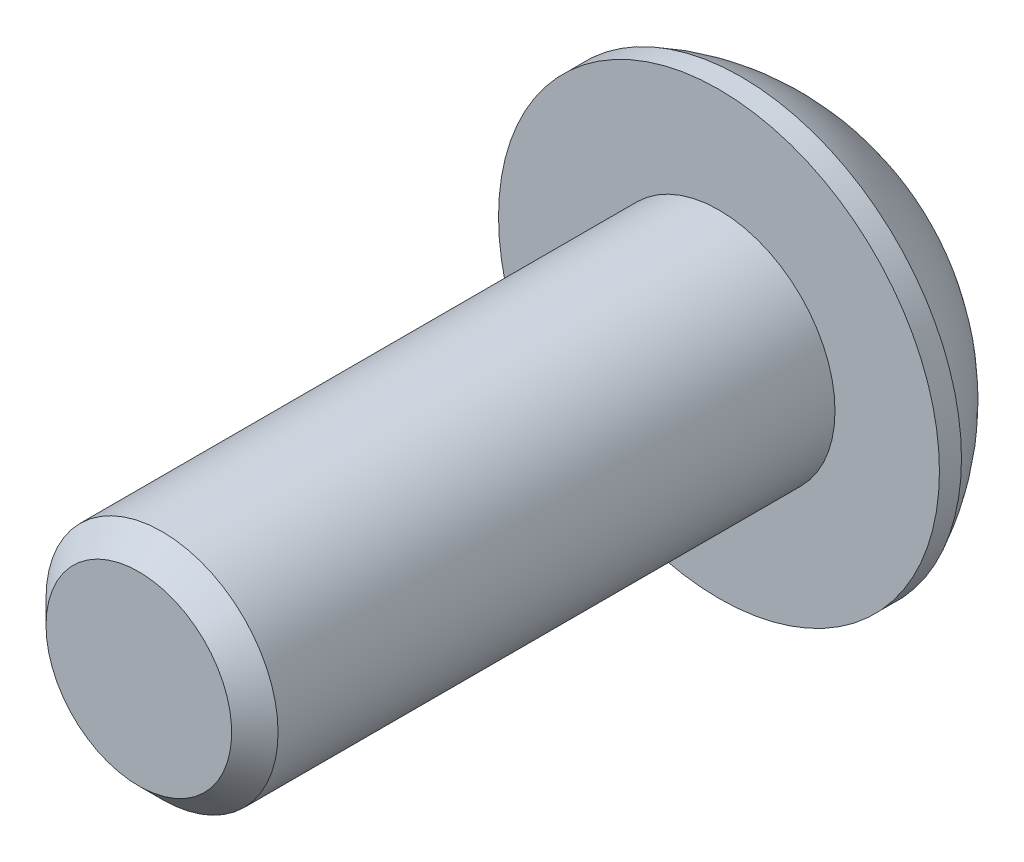
ISO-10303-21;
HEADER;
FILE_DESCRIPTION(('STEP AP214'),'2;1');
FILE_NAME('part.step','',(''),(''),'','','');
FILE_SCHEMA(('AUTOMOTIVE_DESIGN { 1 0 10303 214 1 1 1 1 }'));
ENDSEC;
DATA;
#1=APPLICATION_CONTEXT('core data for automotive mechanical design processes');
#2=APPLICATION_PROTOCOL_DEFINITION('international standard','automotive_design',2000,#1);
#3=PRODUCT_CONTEXT('',#1,'mechanical');
#4=PRODUCT('Part','Part','',(#3));
#5=PRODUCT_RELATED_PRODUCT_CATEGORY('part','',(#4));
#6=PRODUCT_DEFINITION_FORMATION('','',#4);
#7=PRODUCT_DEFINITION_CONTEXT('part definition',#1,'design');
#8=PRODUCT_DEFINITION('design','',#6,#7);
#9=PRODUCT_DEFINITION_SHAPE('','',#8);
#10=(LENGTH_UNIT() NAMED_UNIT(*) SI_UNIT(.MILLI.,.METRE.));
#11=(NAMED_UNIT(*) PLANE_ANGLE_UNIT() SI_UNIT($,.RADIAN.));
#12=(NAMED_UNIT(*) SI_UNIT($,.STERADIAN.) SOLID_ANGLE_UNIT());
#13=UNCERTAINTY_MEASURE_WITH_UNIT(LENGTH_MEASURE(1.E-05),#10,'distance_accuracy_value','');
#14=(GEOMETRIC_REPRESENTATION_CONTEXT(3) GLOBAL_UNCERTAINTY_ASSIGNED_CONTEXT((#13)) GLOBAL_UNIT_ASSIGNED_CONTEXT((#10,
#11,#12)) REPRESENTATION_CONTEXT('',''));
#15=CARTESIAN_POINT('',(0.,0.,0.));
#16=DIRECTION('',(0.,0.,1.));
#17=DIRECTION('',(1.,0.,0.));
#18=AXIS2_PLACEMENT_3D('',#15,#16,#17);
#19=CARTESIAN_POINT('',(0.,0.,-1.06));
#20=DIRECTION('',(0.,0.,1.));
#21=DIRECTION('',(1.,0.,0.));
#22=AXIS2_PLACEMENT_3D('',#19,#20,#21);
#23=PLANE('',#22);
#24=DIRECTION('',(-0.866025403784439,-0.5,0.));
#25=VECTOR('',#24,1.);
#26=CARTESIAN_POINT('',(-1.25,0.721687836487032,-1.06));
#27=LINE('',#26,#25);
#28=CARTESIAN_POINT('',(-1.25,0.721687836487032,-1.06));
#29=VERTEX_POINT('',#28);
#30=CARTESIAN_POINT('',(0.,1.44337567297406,-1.06));
#31=VERTEX_POINT('',#30);
#32=EDGE_CURVE('E68',#29,#31,#27,.F.);
#33=ORIENTED_EDGE('',*,*,#32,.T.);
#34=DIRECTION('',(-0.866025403784439,0.5,0.));
#35=VECTOR('',#34,1.);
#36=CARTESIAN_POINT('',(0.,1.44337567297406,-1.06));
#37=LINE('',#36,#35);
#38=CARTESIAN_POINT('',(1.25,0.721687836487031,-1.06));
#39=VERTEX_POINT('',#38);
#40=EDGE_CURVE('E70',#31,#39,#37,.F.);
#41=ORIENTED_EDGE('',*,*,#40,.T.);
#42=DIRECTION('',(0.,1.,0.));
#43=VECTOR('',#42,1.);
#44=CARTESIAN_POINT('',(1.25,0.721687836487032,-1.06));
#45=LINE('',#44,#43);
#46=CARTESIAN_POINT('',(1.25,-0.721687836487032,-1.06));
#47=VERTEX_POINT('',#46);
#48=EDGE_CURVE('E72',#39,#47,#45,.F.);
#49=ORIENTED_EDGE('',*,*,#48,.T.);
#50=DIRECTION('',(0.866025403784439,0.499999999999999,0.));
#51=VECTOR('',#50,1.);
#52=CARTESIAN_POINT('',(1.25,-0.721687836487032,-1.06));
#53=LINE('',#52,#51);
#54=CARTESIAN_POINT('',(0.,-1.44337567297406,-1.06));
#55=VERTEX_POINT('',#54);
#56=EDGE_CURVE('E144',#47,#55,#53,.F.);
#57=ORIENTED_EDGE('',*,*,#56,.T.);
#58=DIRECTION('',(0.866025403784438,-0.5,0.));
#59=VECTOR('',#58,1.);
#60=CARTESIAN_POINT('',(0.,-1.44337567297406,-1.06));
#61=LINE('',#60,#59);
#62=CARTESIAN_POINT('',(-1.25,-0.721687836487031,-1.06));
#63=VERTEX_POINT('',#62);
#64=EDGE_CURVE('E151',#55,#63,#61,.F.);
#65=ORIENTED_EDGE('',*,*,#64,.T.);
#66=DIRECTION('',(0.,1.,0.));
#67=VECTOR('',#66,1.);
#68=CARTESIAN_POINT('',(-1.25,-0.721687836487032,-1.06));
#69=LINE('',#68,#67);
#70=EDGE_CURVE('E157',#63,#29,#69,.T.);
#71=ORIENTED_EDGE('',*,*,#70,.T.);
#72=EDGE_LOOP('',(#33,#41,#49,#57,#65,#71));
#73=FACE_BOUND('',#72,.T.);
#74=ADVANCED_FACE('F16',(#73),#23,.F.);
#75=CARTESIAN_POINT('',(1.25,0.721687836487032,-2.2));
#76=DIRECTION('',(1.,0.,0.));
#77=DIRECTION('',(0.,0.,-1.));
#78=AXIS2_PLACEMENT_3D('',#75,#76,#77);
#79=PLANE('',#78);
#80=ORIENTED_EDGE('',*,*,#48,.F.);
#81=DIRECTION('',(0.,0.,1.));
#82=VECTOR('',#81,1.);
#83=CARTESIAN_POINT('',(1.25,0.721687836487029,-2.2));
#84=LINE('',#83,#82);
#85=CARTESIAN_POINT('',(1.25,0.721687836487031,-2.2));
#86=VERTEX_POINT('',#85);
#87=EDGE_CURVE('E78',#39,#86,#84,.F.);
#88=ORIENTED_EDGE('',*,*,#87,.T.);
#89=DIRECTION('',(0.,1.,0.));
#90=VECTOR('',#89,1.);
#91=CARTESIAN_POINT('',(1.25,-0.95,-2.2));
#92=LINE('',#91,#90);
#93=CARTESIAN_POINT('',(1.25,-0.721687836487032,-2.2));
#94=VERTEX_POINT('',#93);
#95=EDGE_CURVE('E139',#94,#86,#92,.T.);
#96=ORIENTED_EDGE('',*,*,#95,.F.);
#97=DIRECTION('',(0.,0.,1.));
#98=VECTOR('',#97,1.);
#99=CARTESIAN_POINT('',(1.25,-0.721687836487032,-2.2));
#100=LINE('',#99,#98);
#101=EDGE_CURVE('E84',#94,#47,#100,.T.);
#102=ORIENTED_EDGE('',*,*,#101,.T.);
#103=EDGE_LOOP('',(#80,#88,#96,#102));
#104=FACE_BOUND('',#103,.T.);
#105=ADVANCED_FACE('F81',(#104),#79,.F.);
#106=CARTESIAN_POINT('',(0.,1.44337567297406,-2.2));
#107=DIRECTION('',(0.5,0.866025403784439,0.));
#108=DIRECTION('',(-0.866025403784439,0.5,0.));
#109=AXIS2_PLACEMENT_3D('',#106,#107,#108);
#110=PLANE('',#109);
#111=ORIENTED_EDGE('',*,*,#40,.F.);
#112=DIRECTION('',(0.,0.,1.));
#113=VECTOR('',#112,1.);
#114=CARTESIAN_POINT('',(0.,1.44337567297406,-2.2));
#115=LINE('',#114,#113);
#116=CARTESIAN_POINT('',(0.,1.44337567297406,-2.2));
#117=VERTEX_POINT('',#116);
#118=EDGE_CURVE('E97',#31,#117,#115,.F.);
#119=ORIENTED_EDGE('',*,*,#118,.T.);
#120=DIRECTION('',(-0.86602540378444,0.499999999999998,0.));
#121=VECTOR('',#120,1.);
#122=CARTESIAN_POINT('',(1.25,0.721687836487032,-2.2));
#123=LINE('',#122,#121);
#124=EDGE_CURVE('E90',#86,#117,#123,.T.);
#125=ORIENTED_EDGE('',*,*,#124,.F.);
#126=ORIENTED_EDGE('',*,*,#87,.F.);
#127=EDGE_LOOP('',(#111,#119,#125,#126));
#128=FACE_BOUND('',#127,.T.);
#129=ADVANCED_FACE('F88',(#128),#110,.F.);
#130=CARTESIAN_POINT('',(-1.25,0.721687836487032,-2.2));
#131=DIRECTION('',(-0.5,0.866025403784439,0.));
#132=DIRECTION('',(-0.866025403784439,-0.5,0.));
#133=AXIS2_PLACEMENT_3D('',#130,#131,#132);
#134=PLANE('',#133);
#135=ORIENTED_EDGE('',*,*,#32,.F.);
#136=DIRECTION('',(0.,0.,1.));
#137=VECTOR('',#136,1.);
#138=CARTESIAN_POINT('',(-1.25,0.721687836487032,-2.2));
#139=LINE('',#138,#137);
#140=CARTESIAN_POINT('',(-1.25,0.721687836487032,-2.2));
#141=VERTEX_POINT('',#140);
#142=EDGE_CURVE('E154',#29,#141,#139,.F.);
#143=ORIENTED_EDGE('',*,*,#142,.T.);
#144=DIRECTION('',(-0.86602540378444,-0.499999999999998,0.));
#145=VECTOR('',#144,1.);
#146=CARTESIAN_POINT('',(0.,1.44337567297406,-2.2));
#147=LINE('',#146,#145);
#148=EDGE_CURVE('E133',#117,#141,#147,.T.);
#149=ORIENTED_EDGE('',*,*,#148,.F.);
#150=ORIENTED_EDGE('',*,*,#118,.F.);
#151=EDGE_LOOP('',(#135,#143,#149,#150));
#152=FACE_BOUND('',#151,.T.);
#153=ADVANCED_FACE('F161',(#152),#134,.F.);
#154=CARTESIAN_POINT('',(-1.25,-0.721687836487032,-2.2));
#155=DIRECTION('',(-1.,0.,0.));
#156=DIRECTION('',(0.,0.,1.));
#157=AXIS2_PLACEMENT_3D('',#154,#155,#156);
#158=PLANE('',#157);
#159=ORIENTED_EDGE('',*,*,#70,.F.);
#160=DIRECTION('',(0.,0.,1.));
#161=VECTOR('',#160,1.);
#162=CARTESIAN_POINT('',(-1.25,-0.721687836487029,-2.2));
#163=LINE('',#162,#161);
#164=CARTESIAN_POINT('',(-1.25,-0.721687836487031,-2.2));
#165=VERTEX_POINT('',#164);
#166=EDGE_CURVE('E148',#63,#165,#163,.F.);
#167=ORIENTED_EDGE('',*,*,#166,.T.);
#168=DIRECTION('',(0.,1.,0.));
#169=VECTOR('',#168,1.);
#170=CARTESIAN_POINT('',(-1.25,-0.95,-2.2));
#171=LINE('',#170,#169);
#172=EDGE_CURVE('E129',#141,#165,#171,.F.);
#173=ORIENTED_EDGE('',*,*,#172,.F.);
#174=ORIENTED_EDGE('',*,*,#142,.F.);
#175=EDGE_LOOP('',(#159,#167,#173,#174));
#176=FACE_BOUND('',#175,.T.);
#177=ADVANCED_FACE('F173',(#176),#158,.F.);
#178=CARTESIAN_POINT('',(0.,-1.44337567297406,-2.2));
#179=DIRECTION('',(-0.5,-0.866025403784438,0.));
#180=DIRECTION('',(0.866025403784438,-0.5,0.));
#181=AXIS2_PLACEMENT_3D('',#178,#179,#180);
#182=PLANE('',#181);
#183=ORIENTED_EDGE('',*,*,#64,.F.);
#184=DIRECTION('',(0.,0.,1.));
#185=VECTOR('',#184,1.);
#186=CARTESIAN_POINT('',(0.,-1.44337567297406,-2.2));
#187=LINE('',#186,#185);
#188=CARTESIAN_POINT('',(0.,-1.44337567297406,-2.2));
#189=VERTEX_POINT('',#188);
#190=EDGE_CURVE('E35',#55,#189,#187,.F.);
#191=ORIENTED_EDGE('',*,*,#190,.T.);
#192=DIRECTION('',(0.86602540378444,-0.499999999999998,0.));
#193=VECTOR('',#192,1.);
#194=CARTESIAN_POINT('',(-1.25,-0.721687836487032,-2.2));
#195=LINE('',#194,#193);
#196=EDGE_CURVE('E125',#165,#189,#195,.T.);
#197=ORIENTED_EDGE('',*,*,#196,.F.);
#198=ORIENTED_EDGE('',*,*,#166,.F.);
#199=EDGE_LOOP('',(#183,#191,#197,#198));
#200=FACE_BOUND('',#199,.T.);
#201=ADVANCED_FACE('F171',(#200),#182,.F.);
#202=CARTESIAN_POINT('',(1.25,-0.721687836487032,-2.2));
#203=DIRECTION('',(0.499999999999999,-0.866025403784439,0.));
#204=DIRECTION('',(0.866025403784439,0.499999999999999,0.));
#205=AXIS2_PLACEMENT_3D('',#202,#203,#204);
#206=PLANE('',#205);
#207=ORIENTED_EDGE('',*,*,#56,.F.);
#208=ORIENTED_EDGE('',*,*,#101,.F.);
#209=DIRECTION('',(0.86602540378444,0.499999999999998,0.));
#210=VECTOR('',#209,1.);
#211=CARTESIAN_POINT('',(0.,-1.44337567297406,-2.2));
#212=LINE('',#211,#210);
#213=EDGE_CURVE('E119',#189,#94,#212,.T.);
#214=ORIENTED_EDGE('',*,*,#213,.F.);
#215=ORIENTED_EDGE('',*,*,#190,.F.);
#216=EDGE_LOOP('',(#207,#208,#214,#215));
#217=FACE_BOUND('',#216,.T.);
#218=ADVANCED_FACE('F168',(#217),#206,.F.);
#219=CARTESIAN_POINT('',(0.,-0.95,-2.2));
#220=DIRECTION('',(0.,0.,-1.));
#221=DIRECTION('',(-1.,0.,0.));
#222=AXIS2_PLACEMENT_3D('',#219,#220,#221);
#223=PLANE('',#222);
#224=ORIENTED_EDGE('',*,*,#196,.T.);
#225=ORIENTED_EDGE('',*,*,#213,.T.);
#226=ORIENTED_EDGE('',*,*,#95,.T.);
#227=ORIENTED_EDGE('',*,*,#124,.T.);
#228=ORIENTED_EDGE('',*,*,#148,.T.);
#229=ORIENTED_EDGE('',*,*,#172,.T.);
#230=EDGE_LOOP('',(#224,#225,#226,#227,#228,#229));
#231=FACE_BOUND('',#230,.T.);
#232=CARTESIAN_POINT('',(0.,0.,-2.2));
#233=DIRECTION('',(0.,0.,-1.));
#234=DIRECTION('',(-1.,0.,0.));
#235=AXIS2_PLACEMENT_3D('',#232,#233,#234);
#236=CIRCLE('',#235,1.9);
#237=CARTESIAN_POINT('',(-1.9,0.,-2.2));
#238=VERTEX_POINT('',#237);
#239=EDGE_CURVE('E19',#238,#238,#236,.F.);
#240=ORIENTED_EDGE('',*,*,#239,.F.);
#241=EDGE_LOOP('',(#240));
#242=FACE_BOUND('',#241,.T.);
#243=ADVANCED_FACE('F165',(#231,#242),#223,.T.);
#244=CARTESIAN_POINT('',(0.,0.,1.35966483516485));
#245=DIRECTION('',(0.,0.,-1.));
#246=DIRECTION('',(0.,-1.,0.));
#247=AXIS2_PLACEMENT_3D('',#244,#245,#246);
#248=DEGENERATE_TOROIDAL_SURFACE('',#247,0.311899999999986,3.89785522418538,.T.);
#249=CARTESIAN_POINT('',(0.,0.,-0.380000000000001));
#250=DIRECTION('',(0.,0.,-1.));
#251=DIRECTION('',(-1.,0.,0.));
#252=AXIS2_PLACEMENT_3D('',#249,#250,#251);
#253=CIRCLE('',#252,3.8);
#254=CARTESIAN_POINT('',(-3.8,0.,-0.380000000000001));
#255=VERTEX_POINT('',#254);
#256=EDGE_CURVE('E107',#255,#255,#253,.F.);
#257=ORIENTED_EDGE('',*,*,#256,.F.);
#258=EDGE_LOOP('',(#257));
#259=FACE_BOUND('',#258,.T.);
#260=ORIENTED_EDGE('',*,*,#239,.T.);
#261=EDGE_LOOP('',(#260));
#262=FACE_BOUND('',#261,.T.);
#263=ADVANCED_FACE('F204',(#259,#262),#248,.T.);
#264=CARTESIAN_POINT('',(0.,0.,10.));
#265=DIRECTION('',(0.,0.,1.));
#266=DIRECTION('',(1.,0.,0.));
#267=AXIS2_PLACEMENT_3D('',#264,#265,#266);
#268=PLANE('',#267);
#269=CARTESIAN_POINT('',(0.,0.,9.99999999999091));
#270=DIRECTION('',(0.,0.,-1.));
#271=DIRECTION('',(-1.,0.,0.));
#272=AXIS2_PLACEMENT_3D('',#269,#270,#271);
#273=CIRCLE('',#272,1.59999999993943);
#274=CARTESIAN_POINT('',(-1.59999999993943,0.,9.99999999999091));
#275=VERTEX_POINT('',#274);
#276=EDGE_CURVE('E104',#275,#275,#273,.T.);
#277=ORIENTED_EDGE('',*,*,#276,.F.);
#278=EDGE_LOOP('',(#277));
#279=FACE_BOUND('',#278,.T.);
#280=ADVANCED_FACE('F200',(#279),#268,.T.);
#281=CARTESIAN_POINT('',(0.,0.,-0.19));
#282=DIRECTION('',(0.,0.,-1.));
#283=DIRECTION('',(-1.,0.,0.));
#284=AXIS2_PLACEMENT_3D('',#281,#282,#283);
#285=CYLINDRICAL_SURFACE('',#284,3.8);
#286=CARTESIAN_POINT('',(0.,0.,0.));
#287=DIRECTION('',(0.,0.,-1.));
#288=DIRECTION('',(-1.,0.,0.));
#289=AXIS2_PLACEMENT_3D('',#286,#287,#288);
#290=CIRCLE('',#289,3.8);
#291=CARTESIAN_POINT('',(-3.8,0.,0.));
#292=VERTEX_POINT('',#291);
#293=EDGE_CURVE('E101',#292,#292,#290,.T.);
#294=ORIENTED_EDGE('',*,*,#293,.T.);
#295=EDGE_LOOP('',(#294));
#296=FACE_BOUND('',#295,.T.);
#297=ORIENTED_EDGE('',*,*,#256,.T.);
#298=EDGE_LOOP('',(#297));
#299=FACE_BOUND('',#298,.T.);
#300=ADVANCED_FACE('F196',(#296,#299),#285,.T.);
#301=CARTESIAN_POINT('',(0.,0.,9.60000000003447));
#302=DIRECTION('',(0.,0.,-1.));
#303=DIRECTION('',(-1.,0.,0.));
#304=AXIS2_PLACEMENT_3D('',#301,#302,#303);
#305=CONICAL_SURFACE('',#304,1.99999999989586,0.785398163397448);
#306=CARTESIAN_POINT('',(0.,0.,9.6));
#307=DIRECTION('',(0.,0.,1.));
#308=DIRECTION('',(1.,0.,0.));
#309=AXIS2_PLACEMENT_3D('',#306,#307,#308);
#310=CIRCLE('',#309,2.);
#311=CARTESIAN_POINT('',(2.,0.,9.6));
#312=VERTEX_POINT('',#311);
#313=EDGE_CURVE('E26',#312,#312,#310,.F.);
#314=ORIENTED_EDGE('',*,*,#313,.F.);
#315=EDGE_LOOP('',(#314));
#316=FACE_BOUND('',#315,.T.);
#317=ORIENTED_EDGE('',*,*,#276,.T.);
#318=EDGE_LOOP('',(#317));
#319=FACE_BOUND('',#318,.T.);
#320=ADVANCED_FACE('F189',(#316,#319),#305,.T.);
#321=CARTESIAN_POINT('',(0.,-1.9,0.));
#322=DIRECTION('',(0.,0.,-1.));
#323=DIRECTION('',(-1.,0.,0.));
#324=AXIS2_PLACEMENT_3D('',#321,#322,#323);
#325=PLANE('',#324);
#326=CARTESIAN_POINT('',(0.,0.,0.));
#327=DIRECTION('',(0.,0.,1.));
#328=DIRECTION('',(1.,0.,0.));
#329=AXIS2_PLACEMENT_3D('',#326,#327,#328);
#330=CIRCLE('',#329,2.);
#331=CARTESIAN_POINT('',(2.,0.,0.));
#332=VERTEX_POINT('',#331);
#333=EDGE_CURVE('E11',#332,#332,#330,.T.);
#334=ORIENTED_EDGE('',*,*,#333,.F.);
#335=EDGE_LOOP('',(#334));
#336=FACE_BOUND('',#335,.T.);
#337=ORIENTED_EDGE('',*,*,#293,.F.);
#338=EDGE_LOOP('',(#337));
#339=FACE_BOUND('',#338,.T.);
#340=ADVANCED_FACE('F184',(#336,#339),#325,.F.);
#341=CARTESIAN_POINT('',(0.,0.,0.));
#342=DIRECTION('',(0.,0.,1.));
#343=DIRECTION('',(1.,0.,0.));
#344=AXIS2_PLACEMENT_3D('',#341,#342,#343);
#345=CYLINDRICAL_SURFACE('',#344,2.);
#346=ORIENTED_EDGE('',*,*,#333,.T.);
#347=EDGE_LOOP('',(#346));
#348=FACE_BOUND('',#347,.T.);
#349=ORIENTED_EDGE('',*,*,#313,.T.);
#350=EDGE_LOOP('',(#349));
#351=FACE_BOUND('',#350,.T.);
#352=ADVANCED_FACE('F182',(#348,#351),#345,.T.);
#353=CLOSED_SHELL('',(#74,#105,#129,#153,#177,#201,#218,#243,#263,#280,#300,#320,#340,#352));
#354=MANIFOLD_SOLID_BREP('B1',#353);
#355=ADVANCED_BREP_SHAPE_REPRESENTATION('',(#18,#354),#14);
#356=SHAPE_DEFINITION_REPRESENTATION(#9,#355);
ENDSEC;
END-ISO-10303-21;
